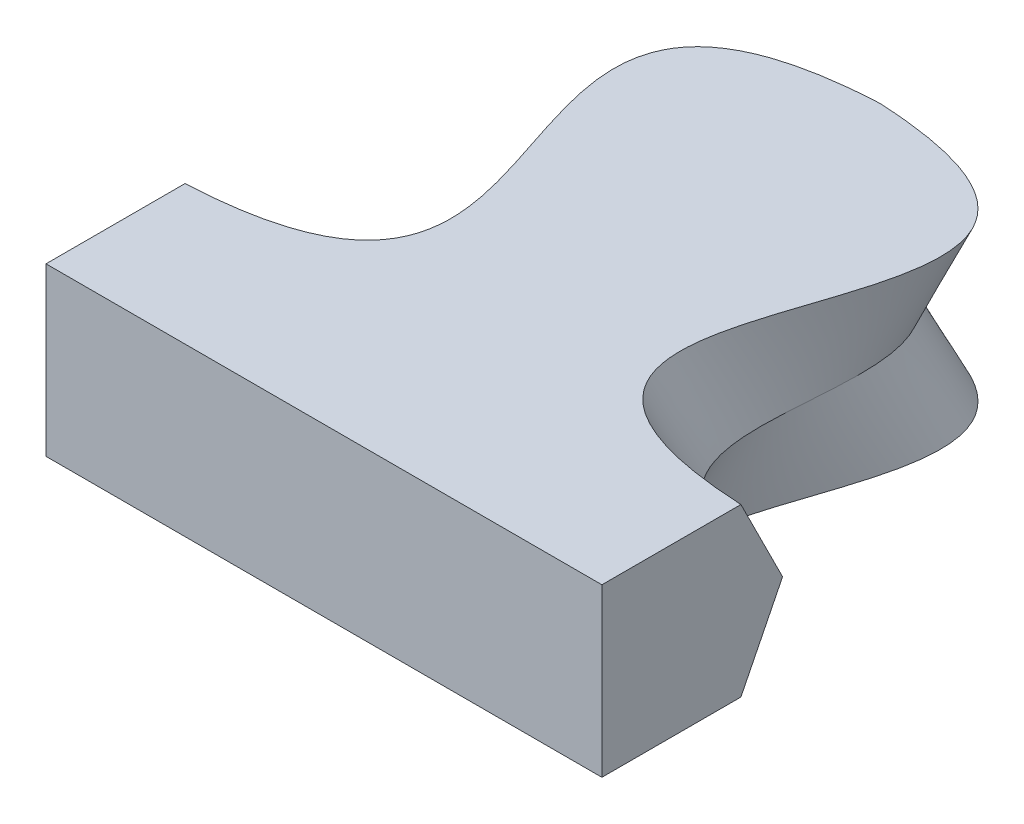
ISO-10303-21;
HEADER;
FILE_DESCRIPTION(('STEP AP214'),'2;1');
FILE_NAME('part.step','',(''),(''),'','','');
FILE_SCHEMA(('AUTOMOTIVE_DESIGN { 1 0 10303 214 1 1 1 1 }'));
ENDSEC;
DATA;
#1=APPLICATION_CONTEXT('core data for automotive mechanical design processes');
#2=APPLICATION_PROTOCOL_DEFINITION('international standard','automotive_design',2000,#1);
#3=PRODUCT_CONTEXT('',#1,'mechanical');
#4=PRODUCT('Part','Part','',(#3));
#5=PRODUCT_RELATED_PRODUCT_CATEGORY('part','',(#4));
#6=PRODUCT_DEFINITION_FORMATION('','',#4);
#7=PRODUCT_DEFINITION_CONTEXT('part definition',#1,'design');
#8=PRODUCT_DEFINITION('design','',#6,#7);
#9=PRODUCT_DEFINITION_SHAPE('','',#8);
#10=(LENGTH_UNIT() NAMED_UNIT(*) SI_UNIT(.MILLI.,.METRE.));
#11=(NAMED_UNIT(*) PLANE_ANGLE_UNIT() SI_UNIT($,.RADIAN.));
#12=(NAMED_UNIT(*) SI_UNIT($,.STERADIAN.) SOLID_ANGLE_UNIT());
#13=UNCERTAINTY_MEASURE_WITH_UNIT(LENGTH_MEASURE(1.E-05),#10,'distance_accuracy_value','');
#14=(GEOMETRIC_REPRESENTATION_CONTEXT(3) GLOBAL_UNCERTAINTY_ASSIGNED_CONTEXT((#13)) GLOBAL_UNIT_ASSIGNED_CONTEXT((#10,
#11,#12)) REPRESENTATION_CONTEXT('',''));
#15=CARTESIAN_POINT('',(0.,0.,0.));
#16=DIRECTION('',(0.,0.,1.));
#17=DIRECTION('',(1.,0.,0.));
#18=AXIS2_PLACEMENT_3D('',#15,#16,#17);
#19=CARTESIAN_POINT('',(1.,0.,-2.5));
#20=DIRECTION('',(0.,1.,0.));
#21=DIRECTION('',(0.,0.,1.));
#22=AXIS2_PLACEMENT_3D('',#19,#20,#21);
#23=PLANE('',#22);
#24=DIRECTION('',(1.,0.,0.));
#25=VECTOR('',#24,1.);
#26=CARTESIAN_POINT('',(0.,0.,0.));
#27=LINE('',#26,#25);
#28=CARTESIAN_POINT('',(0.,0.,0.));
#29=VERTEX_POINT('',#28);
#30=CARTESIAN_POINT('',(2.,0.,0.));
#31=VERTEX_POINT('',#30);
#32=EDGE_CURVE('E208',#29,#31,#27,.T.);
#33=ORIENTED_EDGE('',*,*,#32,.F.);
#34=DIRECTION('',(-1.,0.,0.));
#35=VECTOR('',#34,1.);
#36=CARTESIAN_POINT('',(0.,0.,0.));
#37=LINE('',#36,#35);
#38=CARTESIAN_POINT('',(-2.,0.,0.));
#39=VERTEX_POINT('',#38);
#40=EDGE_CURVE('E182',#29,#39,#37,.T.);
#41=ORIENTED_EDGE('',*,*,#40,.T.);
#42=DIRECTION('',(0.,0.,-1.));
#43=VECTOR('',#42,1.);
#44=CARTESIAN_POINT('',(-2.,0.,0.));
#45=LINE('',#44,#43);
#46=CARTESIAN_POINT('',(-2.,0.,-1.));
#47=VERTEX_POINT('',#46);
#48=EDGE_CURVE('E192',#39,#47,#45,.T.);
#49=ORIENTED_EDGE('',*,*,#48,.T.);
#50=CARTESIAN_POINT('',(-2.,0.,-1.));
#51=CARTESIAN_POINT('',(0.939621293878363,0.,-1.1463183269814));
#52=CARTESIAN_POINT('',(-2.93962129387836,0.,-3.8536816730186));
#53=CARTESIAN_POINT('',(0.,0.,-4.));
#54=B_SPLINE_CURVE_WITH_KNOTS('',3,(#50,#51,#52,#53),.UNSPECIFIED.,.F.,.F.,(4,4),(0.,1.),.UNSPECIFIED.);
#55=CARTESIAN_POINT('',(0.,0.,-4.));
#56=VERTEX_POINT('',#55);
#57=EDGE_CURVE('E202',#47,#56,#54,.T.);
#58=ORIENTED_EDGE('',*,*,#57,.T.);
#59=CARTESIAN_POINT('',(2.,0.,-1.));
#60=CARTESIAN_POINT('',(-0.939621293878363,0.,-1.1463183269814));
#61=CARTESIAN_POINT('',(2.93962129387836,0.,-3.8536816730186));
#62=CARTESIAN_POINT('',(0.,0.,-4.));
#63=B_SPLINE_CURVE_WITH_KNOTS('',3,(#59,#60,#61,#62),.UNSPECIFIED.,.F.,.F.,(4,4),(0.,1.),.UNSPECIFIED.);
#64=CARTESIAN_POINT('',(2.,0.,-1.));
#65=VERTEX_POINT('',#64);
#66=EDGE_CURVE('E133',#65,#56,#63,.T.);
#67=ORIENTED_EDGE('',*,*,#66,.F.);
#68=DIRECTION('',(0.,0.,-1.));
#69=VECTOR('',#68,1.);
#70=CARTESIAN_POINT('',(2.,0.,0.));
#71=LINE('',#70,#69);
#72=EDGE_CURVE('E447',#31,#65,#71,.T.);
#73=ORIENTED_EDGE('',*,*,#72,.F.);
#74=EDGE_LOOP('',(#33,#41,#49,#58,#67,#73));
#75=FACE_BOUND('',#74,.T.);
#76=ADVANCED_FACE('F107',(#75),#23,.F.);
#77=CARTESIAN_POINT('',(0.,0.,0.));
#78=DIRECTION('',(0.,0.,-1.));
#79=DIRECTION('',(-1.,0.,0.));
#80=AXIS2_PLACEMENT_3D('',#77,#78,#79);
#81=PLANE('',#80);
#82=DIRECTION('',(0.,1.,0.));
#83=VECTOR('',#82,1.);
#84=CARTESIAN_POINT('',(2.,0.,0.));
#85=LINE('',#84,#83);
#86=CARTESIAN_POINT('',(2.,1.2,0.));
#87=VERTEX_POINT('',#86);
#88=EDGE_CURVE('E422',#31,#87,#85,.T.);
#89=ORIENTED_EDGE('',*,*,#88,.T.);
#90=DIRECTION('',(1.,0.,0.));
#91=VECTOR('',#90,1.);
#92=CARTESIAN_POINT('',(0.,1.2,0.));
#93=LINE('',#92,#91);
#94=CARTESIAN_POINT('',(0.,1.2,0.));
#95=VERTEX_POINT('',#94);
#96=EDGE_CURVE('E337',#95,#87,#93,.T.);
#97=ORIENTED_EDGE('',*,*,#96,.F.);
#98=DIRECTION('',(-1.,0.,0.));
#99=VECTOR('',#98,1.);
#100=CARTESIAN_POINT('',(0.,1.2,0.));
#101=LINE('',#100,#99);
#102=CARTESIAN_POINT('',(-2.,1.2,0.));
#103=VERTEX_POINT('',#102);
#104=EDGE_CURVE('E185',#95,#103,#101,.T.);
#105=ORIENTED_EDGE('',*,*,#104,.T.);
#106=DIRECTION('',(0.,-1.,0.));
#107=VECTOR('',#106,1.);
#108=CARTESIAN_POINT('',(-2.,1.2,0.));
#109=LINE('',#108,#107);
#110=EDGE_CURVE('E177',#103,#39,#109,.T.);
#111=ORIENTED_EDGE('',*,*,#110,.T.);
#112=ORIENTED_EDGE('',*,*,#40,.F.);
#113=ORIENTED_EDGE('',*,*,#32,.T.);
#114=EDGE_LOOP('',(#89,#97,#105,#111,#112,#113));
#115=FACE_BOUND('',#114,.T.);
#116=ADVANCED_FACE('F179',(#115),#81,.F.);
#117=CARTESIAN_POINT('',(2.,0.,0.));
#118=DIRECTION('',(-1.,0.,0.));
#119=DIRECTION('',(0.,0.,1.));
#120=AXIS2_PLACEMENT_3D('',#117,#118,#119);
#121=PLANE('',#120);
#122=DIRECTION('',(0.,0.894427190999916,-0.447213595499958));
#123=VECTOR('',#122,1.);
#124=CARTESIAN_POINT('',(2.,0.,-1.));
#125=LINE('',#124,#123);
#126=CARTESIAN_POINT('',(2.,0.6,-1.3));
#127=VERTEX_POINT('',#126);
#128=EDGE_CURVE('E415',#65,#127,#125,.T.);
#129=ORIENTED_EDGE('',*,*,#128,.T.);
#130=DIRECTION('',(0.,-0.894427190999916,-0.447213595499958));
#131=VECTOR('',#130,1.);
#132=CARTESIAN_POINT('',(2.,1.2,-1.));
#133=LINE('',#132,#131);
#134=CARTESIAN_POINT('',(2.,1.2,-1.));
#135=VERTEX_POINT('',#134);
#136=EDGE_CURVE('E486',#135,#127,#133,.T.);
#137=ORIENTED_EDGE('',*,*,#136,.F.);
#138=DIRECTION('',(0.,0.,-1.));
#139=VECTOR('',#138,1.);
#140=CARTESIAN_POINT('',(2.,1.2,0.));
#141=LINE('',#140,#139);
#142=EDGE_CURVE('E395',#87,#135,#141,.T.);
#143=ORIENTED_EDGE('',*,*,#142,.F.);
#144=ORIENTED_EDGE('',*,*,#88,.F.);
#145=ORIENTED_EDGE('',*,*,#72,.T.);
#146=EDGE_LOOP('',(#129,#137,#143,#144,#145));
#147=FACE_BOUND('',#146,.T.);
#148=ADVANCED_FACE('F400',(#147),#121,.F.);
#149=CARTESIAN_POINT('',(2.,0.,-1.));
#150=CARTESIAN_POINT('',(2.00000000000001,0.6,-1.3));
#151=CARTESIAN_POINT('',(-0.939621293878363,0.,-1.1463183269814));
#152=CARTESIAN_POINT('',(-0.166666666666679,0.6,-1.3));
#153=CARTESIAN_POINT('',(2.93962129387836,0.,-3.8536816730186));
#154=CARTESIAN_POINT('',(2.16666666666667,0.6,-3.7));
#155=CARTESIAN_POINT('',(0.,0.,-4.));
#156=CARTESIAN_POINT('',(0.,0.6,-3.7));
#157=B_SPLINE_SURFACE_WITH_KNOTS('',3,1,((#149,#150),(#151,#152),(#153,#154),(#155,#156)),
.UNSPECIFIED.,.F.,.F.,.F.,(4,4),(2,2),(0.,1.),(0.,1.),.UNSPECIFIED.);
#158=DIRECTION('',(0.,0.894427190999916,0.447213595499958));
#159=VECTOR('',#158,1.);
#160=CARTESIAN_POINT('',(0.,0.3,-3.85));
#161=LINE('',#160,#159);
#162=CARTESIAN_POINT('',(0.,0.6,-3.7));
#163=VERTEX_POINT('',#162);
#164=EDGE_CURVE('E121',#56,#163,#161,.T.);
#165=CARTESIAN_POINT('',(2.00000000000001,0.6,-1.3));
#166=CARTESIAN_POINT('',(-0.166666666666679,0.6,-1.3));
#167=CARTESIAN_POINT('',(2.16666666666667,0.6,-3.7));
#168=CARTESIAN_POINT('',(0.,0.6,-3.7));
#169=B_SPLINE_CURVE_WITH_KNOTS('',3,(#165,#166,#167,#168),.UNSPECIFIED.,.F.,.F.,(4,4),(0.,1.),.UNSPECIFIED.);
#170=EDGE_CURVE('E12',#127,#163,#169,.T.);
#171=ORIENTED_EDGE('',*,*,#66,.T.);
#172=ORIENTED_EDGE('',*,*,#164,.T.);
#173=ORIENTED_EDGE('',*,*,#170,.F.);
#174=ORIENTED_EDGE('',*,*,#128,.F.);
#175=EDGE_LOOP('',(#171,#172,#173,#174));
#176=FACE_BOUND('',#175,.T.);
#177=ADVANCED_FACE('F109',(#176),#157,.T.);
#178=CARTESIAN_POINT('',(1.,1.2,-2.5));
#179=DIRECTION('',(0.,-1.,0.));
#180=DIRECTION('',(0.,0.,1.));
#181=AXIS2_PLACEMENT_3D('',#178,#179,#180);
#182=PLANE('',#181);
#183=CARTESIAN_POINT('',(2.,1.2,-1.));
#184=CARTESIAN_POINT('',(-0.939621293878363,1.2,-1.1463183269814));
#185=CARTESIAN_POINT('',(2.93962129387836,1.2,-3.8536816730186));
#186=CARTESIAN_POINT('',(0.,1.2,-4.));
#187=B_SPLINE_CURVE_WITH_KNOTS('',3,(#183,#184,#185,#186),.UNSPECIFIED.,.F.,.F.,(4,4),(0.,1.),.UNSPECIFIED.);
#188=CARTESIAN_POINT('',(0.,1.2,-4.));
#189=VERTEX_POINT('',#188);
#190=EDGE_CURVE('E474',#135,#189,#187,.T.);
#191=ORIENTED_EDGE('',*,*,#190,.T.);
#192=CARTESIAN_POINT('',(-2.,1.2,-1.));
#193=CARTESIAN_POINT('',(0.939621293878363,1.2,-1.1463183269814));
#194=CARTESIAN_POINT('',(-2.93962129387836,1.2,-3.8536816730186));
#195=CARTESIAN_POINT('',(0.,1.2,-4.));
#196=B_SPLINE_CURVE_WITH_KNOTS('',3,(#192,#193,#194,#195),.UNSPECIFIED.,.F.,.F.,(4,4),(0.,1.),.UNSPECIFIED.);
#197=CARTESIAN_POINT('',(-2.,1.2,-1.));
#198=VERTEX_POINT('',#197);
#199=EDGE_CURVE('E345',#198,#189,#196,.T.);
#200=ORIENTED_EDGE('',*,*,#199,.F.);
#201=DIRECTION('',(0.,0.,-1.));
#202=VECTOR('',#201,1.);
#203=CARTESIAN_POINT('',(-2.,1.2,0.));
#204=LINE('',#203,#202);
#205=EDGE_CURVE('E274',#103,#198,#204,.T.);
#206=ORIENTED_EDGE('',*,*,#205,.F.);
#207=ORIENTED_EDGE('',*,*,#104,.F.);
#208=ORIENTED_EDGE('',*,*,#96,.T.);
#209=ORIENTED_EDGE('',*,*,#142,.T.);
#210=EDGE_LOOP('',(#191,#200,#206,#207,#208,#209));
#211=FACE_BOUND('',#210,.T.);
#212=ADVANCED_FACE('F308',(#211),#182,.F.);
#213=CARTESIAN_POINT('',(2.,1.2,-1.));
#214=CARTESIAN_POINT('',(2.00000000000001,0.6,-1.3));
#215=CARTESIAN_POINT('',(-0.939621293878363,1.2,-1.1463183269814));
#216=CARTESIAN_POINT('',(-0.166666666666679,0.6,-1.3));
#217=CARTESIAN_POINT('',(2.93962129387836,1.2,-3.8536816730186));
#218=CARTESIAN_POINT('',(2.16666666666667,0.6,-3.7));
#219=CARTESIAN_POINT('',(0.,1.2,-4.));
#220=CARTESIAN_POINT('',(0.,0.6,-3.7));
#221=B_SPLINE_SURFACE_WITH_KNOTS('',3,1,((#213,#214),(#215,#216),(#217,#218),(#219,#220)),
.UNSPECIFIED.,.F.,.F.,.F.,(4,4),(2,2),(0.,1.),(0.,1.),.UNSPECIFIED.);
#222=DIRECTION('',(0.,-0.894427190999916,0.447213595499958));
#223=VECTOR('',#222,1.);
#224=CARTESIAN_POINT('',(0.,0.9,-3.85));
#225=LINE('',#224,#223);
#226=EDGE_CURVE('E492',#189,#163,#225,.T.);
#227=ORIENTED_EDGE('',*,*,#190,.F.);
#228=ORIENTED_EDGE('',*,*,#136,.T.);
#229=ORIENTED_EDGE('',*,*,#170,.T.);
#230=ORIENTED_EDGE('',*,*,#226,.F.);
#231=EDGE_LOOP('',(#227,#228,#229,#230));
#232=FACE_BOUND('',#231,.T.);
#233=ADVANCED_FACE('F227',(#232),#221,.F.);
#234=CARTESIAN_POINT('',(-2.,1.2,0.));
#235=DIRECTION('',(1.,0.,0.));
#236=DIRECTION('',(0.,0.,1.));
#237=AXIS2_PLACEMENT_3D('',#234,#235,#236);
#238=PLANE('',#237);
#239=DIRECTION('',(0.,-0.894427190999916,-0.447213595499958));
#240=VECTOR('',#239,1.);
#241=CARTESIAN_POINT('',(-2.,1.2,-1.));
#242=LINE('',#241,#240);
#243=CARTESIAN_POINT('',(-2.,0.6,-1.3));
#244=VERTEX_POINT('',#243);
#245=EDGE_CURVE('E189',#198,#244,#242,.T.);
#246=ORIENTED_EDGE('',*,*,#245,.T.);
#247=DIRECTION('',(0.,0.894427190999916,-0.447213595499958));
#248=VECTOR('',#247,1.);
#249=CARTESIAN_POINT('',(-2.,0.,-1.));
#250=LINE('',#249,#248);
#251=EDGE_CURVE('E197',#47,#244,#250,.T.);
#252=ORIENTED_EDGE('',*,*,#251,.F.);
#253=ORIENTED_EDGE('',*,*,#48,.F.);
#254=ORIENTED_EDGE('',*,*,#110,.F.);
#255=ORIENTED_EDGE('',*,*,#205,.T.);
#256=EDGE_LOOP('',(#246,#252,#253,#254,#255));
#257=FACE_BOUND('',#256,.T.);
#258=ADVANCED_FACE('F195',(#257),#238,.F.);
#259=CARTESIAN_POINT('',(-2.,1.2,-1.));
#260=CARTESIAN_POINT('',(-2.00000000000001,0.6,-1.3));
#261=CARTESIAN_POINT('',(0.939621293878363,1.2,-1.1463183269814));
#262=CARTESIAN_POINT('',(0.166666666666679,0.6,-1.3));
#263=CARTESIAN_POINT('',(-2.93962129387836,1.2,-3.8536816730186));
#264=CARTESIAN_POINT('',(-2.16666666666667,0.6,-3.7));
#265=CARTESIAN_POINT('',(0.,1.2,-4.));
#266=CARTESIAN_POINT('',(0.,0.6,-3.7));
#267=B_SPLINE_SURFACE_WITH_KNOTS('',3,1,((#259,#260),(#261,#262),(#263,#264),(#265,#266)),
.UNSPECIFIED.,.F.,.F.,.F.,(4,4),(2,2),(0.,1.),(0.,1.),.UNSPECIFIED.);
#268=CARTESIAN_POINT('',(-2.00000000000001,0.6,-1.3));
#269=CARTESIAN_POINT('',(0.166666666666679,0.6,-1.3));
#270=CARTESIAN_POINT('',(-2.16666666666667,0.6,-3.7));
#271=CARTESIAN_POINT('',(0.,0.6,-3.7));
#272=B_SPLINE_CURVE_WITH_KNOTS('',3,(#268,#269,#270,#271),.UNSPECIFIED.,.F.,.F.,(4,4),(0.,1.),.UNSPECIFIED.);
#273=EDGE_CURVE('E381',#244,#163,#272,.T.);
#274=ORIENTED_EDGE('',*,*,#199,.T.);
#275=ORIENTED_EDGE('',*,*,#226,.T.);
#276=ORIENTED_EDGE('',*,*,#273,.F.);
#277=ORIENTED_EDGE('',*,*,#245,.F.);
#278=EDGE_LOOP('',(#274,#275,#276,#277));
#279=FACE_BOUND('',#278,.T.);
#280=ADVANCED_FACE('F290',(#279),#267,.T.);
#281=CARTESIAN_POINT('',(-2.,0.,-1.));
#282=CARTESIAN_POINT('',(-2.00000000000001,0.6,-1.3));
#283=CARTESIAN_POINT('',(0.939621293878363,0.,-1.1463183269814));
#284=CARTESIAN_POINT('',(0.166666666666679,0.6,-1.3));
#285=CARTESIAN_POINT('',(-2.93962129387836,0.,-3.8536816730186));
#286=CARTESIAN_POINT('',(-2.16666666666667,0.6,-3.7));
#287=CARTESIAN_POINT('',(0.,0.,-4.));
#288=CARTESIAN_POINT('',(0.,0.6,-3.7));
#289=B_SPLINE_SURFACE_WITH_KNOTS('',3,1,((#281,#282),(#283,#284),(#285,#286),(#287,#288)),
.UNSPECIFIED.,.F.,.F.,.F.,(4,4),(2,2),(0.,1.),(0.,1.),.UNSPECIFIED.);
#290=ORIENTED_EDGE('',*,*,#57,.F.);
#291=ORIENTED_EDGE('',*,*,#251,.T.);
#292=ORIENTED_EDGE('',*,*,#273,.T.);
#293=ORIENTED_EDGE('',*,*,#164,.F.);
#294=EDGE_LOOP('',(#290,#291,#292,#293));
#295=FACE_BOUND('',#294,.T.);
#296=ADVANCED_FACE('F291',(#295),#289,.F.);
#297=CLOSED_SHELL('',(#76,#116,#148,#177,#212,#233,#258,#280,#296));
#298=MANIFOLD_SOLID_BREP('B2',#297);
#299=ADVANCED_BREP_SHAPE_REPRESENTATION('',(#18,#298),#14);
#300=SHAPE_DEFINITION_REPRESENTATION(#9,#299);
ENDSEC;
END-ISO-10303-21;
